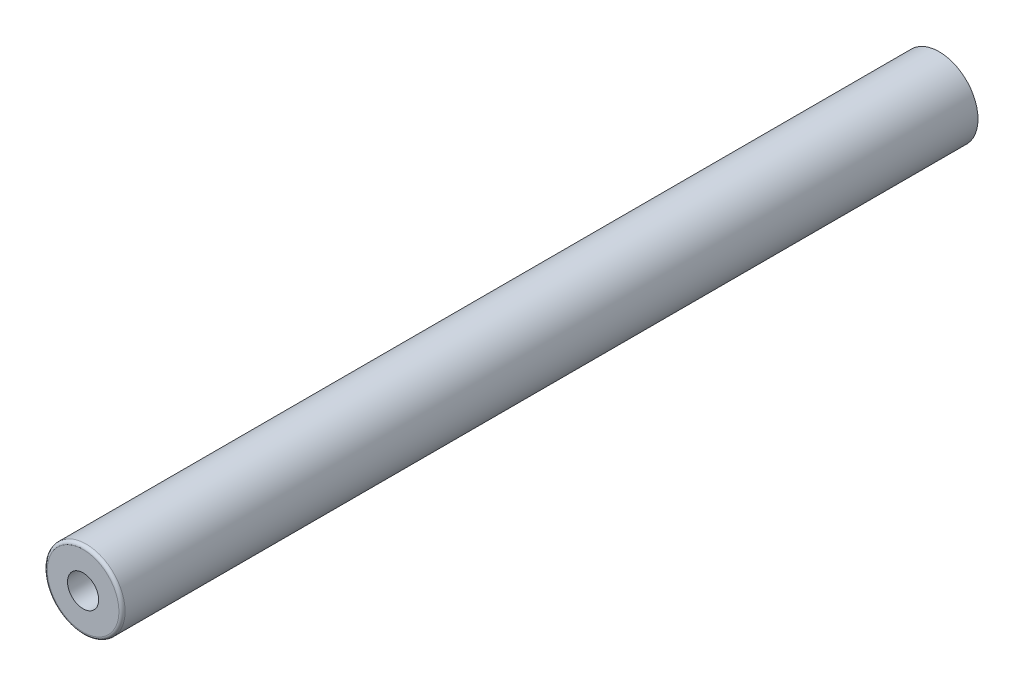
ISO-10303-21;
HEADER;
FILE_DESCRIPTION(('STEP AP214'),'2;1');
FILE_NAME('part.step','',(''),(''),'','','');
FILE_SCHEMA(('AUTOMOTIVE_DESIGN { 1 0 10303 214 1 1 1 1 }'));
ENDSEC;
DATA;
#1=APPLICATION_CONTEXT('core data for automotive mechanical design processes');
#2=APPLICATION_PROTOCOL_DEFINITION('international standard','automotive_design',2000,#1);
#3=PRODUCT_CONTEXT('',#1,'mechanical');
#4=PRODUCT('Part','Part','',(#3));
#5=PRODUCT_RELATED_PRODUCT_CATEGORY('part','',(#4));
#6=PRODUCT_DEFINITION_FORMATION('','',#4);
#7=PRODUCT_DEFINITION_CONTEXT('part definition',#1,'design');
#8=PRODUCT_DEFINITION('design','',#6,#7);
#9=PRODUCT_DEFINITION_SHAPE('','',#8);
#10=(LENGTH_UNIT() NAMED_UNIT(*) SI_UNIT(.MILLI.,.METRE.));
#11=(NAMED_UNIT(*) PLANE_ANGLE_UNIT() SI_UNIT($,.RADIAN.));
#12=(NAMED_UNIT(*) SI_UNIT($,.STERADIAN.) SOLID_ANGLE_UNIT());
#13=UNCERTAINTY_MEASURE_WITH_UNIT(LENGTH_MEASURE(1.E-05),#10,'distance_accuracy_value','');
#14=(GEOMETRIC_REPRESENTATION_CONTEXT(3) GLOBAL_UNCERTAINTY_ASSIGNED_CONTEXT((#13)) GLOBAL_UNIT_ASSIGNED_CONTEXT((#10,
#11,#12)) REPRESENTATION_CONTEXT('',''));
#15=CARTESIAN_POINT('',(0.,0.,0.));
#16=DIRECTION('',(0.,0.,1.));
#17=DIRECTION('',(1.,0.,0.));
#18=AXIS2_PLACEMENT_3D('',#15,#16,#17);
#19=CARTESIAN_POINT('',(0.,0.,319.317365215732));
#20=DIRECTION('',(0.,0.,1.));
#21=DIRECTION('',(1.,0.,0.));
#22=AXIS2_PLACEMENT_3D('',#19,#20,#21);
#23=CYLINDRICAL_SURFACE('',#22,25.0000000000001);
#24=CARTESIAN_POINT('',(0.,0.,273.));
#25=DIRECTION('',(0.,0.,-1.));
#26=DIRECTION('',(-1.,0.,0.));
#27=AXIS2_PLACEMENT_3D('',#24,#25,#26);
#28=CIRCLE('',#27,25.0000000000001);
#29=CARTESIAN_POINT('',(-25.0000000000001,0.,273.));
#30=VERTEX_POINT('',#29);
#31=EDGE_CURVE('E10',#30,#30,#28,.T.);
#32=ORIENTED_EDGE('',*,*,#31,.T.);
#33=EDGE_LOOP('',(#32));
#34=FACE_BOUND('',#33,.T.);
#35=CARTESIAN_POINT('',(0.,0.,-275.));
#36=DIRECTION('',(0.,0.,1.));
#37=DIRECTION('',(1.,0.,0.));
#38=AXIS2_PLACEMENT_3D('',#35,#36,#37);
#39=CIRCLE('',#38,25.0000000000001);
#40=CARTESIAN_POINT('',(25.0000000000001,0.,-275.));
#41=VERTEX_POINT('',#40);
#42=EDGE_CURVE('E49',#41,#41,#39,.T.);
#43=ORIENTED_EDGE('',*,*,#42,.T.);
#44=EDGE_LOOP('',(#43));
#45=FACE_BOUND('',#44,.T.);
#46=ADVANCED_FACE('F39',(#34,#45),#23,.T.);
#47=CARTESIAN_POINT('',(0.,25.0000000000001,-275.));
#48=DIRECTION('',(0.,0.,1.));
#49=DIRECTION('',(1.,0.,0.));
#50=AXIS2_PLACEMENT_3D('',#47,#48,#49);
#51=PLANE('',#50);
#52=ORIENTED_EDGE('',*,*,#42,.F.);
#53=EDGE_LOOP('',(#52));
#54=FACE_BOUND('',#53,.T.);
#55=CARTESIAN_POINT('',(0.,0.,-275.));
#56=DIRECTION('',(0.,0.,1.));
#57=DIRECTION('',(1.,0.,0.));
#58=AXIS2_PLACEMENT_3D('',#55,#56,#57);
#59=CIRCLE('',#58,20.0000000000001);
#60=CARTESIAN_POINT('',(20.0000000000001,0.,-275.));
#61=VERTEX_POINT('',#60);
#62=EDGE_CURVE('E53',#61,#61,#59,.T.);
#63=ORIENTED_EDGE('',*,*,#62,.T.);
#64=EDGE_LOOP('',(#63));
#65=FACE_BOUND('',#64,.T.);
#66=ADVANCED_FACE('F84',(#54,#65),#51,.F.);
#67=CARTESIAN_POINT('',(0.,0.,319.317365215732));
#68=DIRECTION('',(0.,0.,1.));
#69=DIRECTION('',(1.,0.,0.));
#70=AXIS2_PLACEMENT_3D('',#67,#68,#69);
#71=CYLINDRICAL_SURFACE('',#70,20.);
#72=ORIENTED_EDGE('',*,*,#62,.F.);
#73=EDGE_LOOP('',(#72));
#74=FACE_BOUND('',#73,.T.);
#75=CARTESIAN_POINT('',(0.,0.,235.));
#76=DIRECTION('',(0.,0.,1.));
#77=DIRECTION('',(1.,0.,0.));
#78=AXIS2_PLACEMENT_3D('',#75,#76,#77);
#79=CIRCLE('',#78,20.);
#80=CARTESIAN_POINT('',(20.,0.,235.));
#81=VERTEX_POINT('',#80);
#82=EDGE_CURVE('E56',#81,#81,#79,.T.);
#83=ORIENTED_EDGE('',*,*,#82,.T.);
#84=EDGE_LOOP('',(#83));
#85=FACE_BOUND('',#84,.T.);
#86=ADVANCED_FACE('F87',(#74,#85),#71,.F.);
#87=CARTESIAN_POINT('',(0.,10.,235.));
#88=DIRECTION('',(0.,0.,1.));
#89=DIRECTION('',(1.,0.,0.));
#90=AXIS2_PLACEMENT_3D('',#87,#88,#89);
#91=PLANE('',#90);
#92=ORIENTED_EDGE('',*,*,#82,.F.);
#93=EDGE_LOOP('',(#92));
#94=FACE_BOUND('',#93,.T.);
#95=CARTESIAN_POINT('',(0.,0.,235.));
#96=DIRECTION('',(0.,0.,1.));
#97=DIRECTION('',(1.,0.,0.));
#98=AXIS2_PLACEMENT_3D('',#95,#96,#97);
#99=CIRCLE('',#98,10.);
#100=CARTESIAN_POINT('',(10.,0.,235.));
#101=VERTEX_POINT('',#100);
#102=EDGE_CURVE('E65',#101,#101,#99,.T.);
#103=ORIENTED_EDGE('',*,*,#102,.T.);
#104=EDGE_LOOP('',(#103));
#105=FACE_BOUND('',#104,.T.);
#106=ADVANCED_FACE('F78',(#94,#105),#91,.F.);
#107=CARTESIAN_POINT('',(0.,0.,319.317365215732));
#108=DIRECTION('',(0.,0.,1.));
#109=DIRECTION('',(1.,0.,0.));
#110=AXIS2_PLACEMENT_3D('',#107,#108,#109);
#111=CYLINDRICAL_SURFACE('',#110,10.);
#112=ORIENTED_EDGE('',*,*,#102,.F.);
#113=EDGE_LOOP('',(#112));
#114=FACE_BOUND('',#113,.T.);
#115=CARTESIAN_POINT('',(0.,0.,275.));
#116=DIRECTION('',(0.,0.,1.));
#117=DIRECTION('',(1.,0.,0.));
#118=AXIS2_PLACEMENT_3D('',#115,#116,#117);
#119=CIRCLE('',#118,10.);
#120=CARTESIAN_POINT('',(10.,0.,275.));
#121=VERTEX_POINT('',#120);
#122=EDGE_CURVE('E63',#121,#121,#119,.T.);
#123=ORIENTED_EDGE('',*,*,#122,.T.);
#124=EDGE_LOOP('',(#123));
#125=FACE_BOUND('',#124,.T.);
#126=ADVANCED_FACE('F66',(#114,#125),#111,.F.);
#127=CARTESIAN_POINT('',(0.,10.,275.));
#128=DIRECTION('',(0.,0.,-1.));
#129=DIRECTION('',(-1.,0.,0.));
#130=AXIS2_PLACEMENT_3D('',#127,#128,#129);
#131=PLANE('',#130);
#132=CARTESIAN_POINT('',(0.,0.,275.));
#133=DIRECTION('',(0.,0.,-1.));
#134=DIRECTION('',(-1.,0.,0.));
#135=AXIS2_PLACEMENT_3D('',#132,#133,#134);
#136=CIRCLE('',#135,23.0000000000001);
#137=CARTESIAN_POINT('',(-23.0000000000001,0.,275.));
#138=VERTEX_POINT('',#137);
#139=EDGE_CURVE('E46',#138,#138,#136,.F.);
#140=ORIENTED_EDGE('',*,*,#139,.T.);
#141=EDGE_LOOP('',(#140));
#142=FACE_BOUND('',#141,.T.);
#143=ORIENTED_EDGE('',*,*,#122,.F.);
#144=EDGE_LOOP('',(#143));
#145=FACE_BOUND('',#144,.T.);
#146=ADVANCED_FACE('F72',(#142,#145),#131,.F.);
#147=CARTESIAN_POINT('',(0.,0.,273.));
#148=DIRECTION('',(0.,0.,-1.));
#149=DIRECTION('',(-1.,0.,0.));
#150=AXIS2_PLACEMENT_3D('',#147,#148,#149);
#151=TOROIDAL_SURFACE('',#150,23.0000000000001,2.);
#152=ORIENTED_EDGE('',*,*,#31,.F.);
#153=EDGE_LOOP('',(#152));
#154=FACE_BOUND('',#153,.T.);
#155=ORIENTED_EDGE('',*,*,#139,.F.);
#156=EDGE_LOOP('',(#155));
#157=FACE_BOUND('',#156,.T.);
#158=ADVANCED_FACE('F41',(#154,#157),#151,.T.);
#159=CLOSED_SHELL('',(#46,#66,#86,#106,#126,#146,#158));
#160=MANIFOLD_SOLID_BREP('B2',#159);
#161=ADVANCED_BREP_SHAPE_REPRESENTATION('',(#18,#160),#14);
#162=SHAPE_DEFINITION_REPRESENTATION(#9,#161);
ENDSEC;
END-ISO-10303-21;
